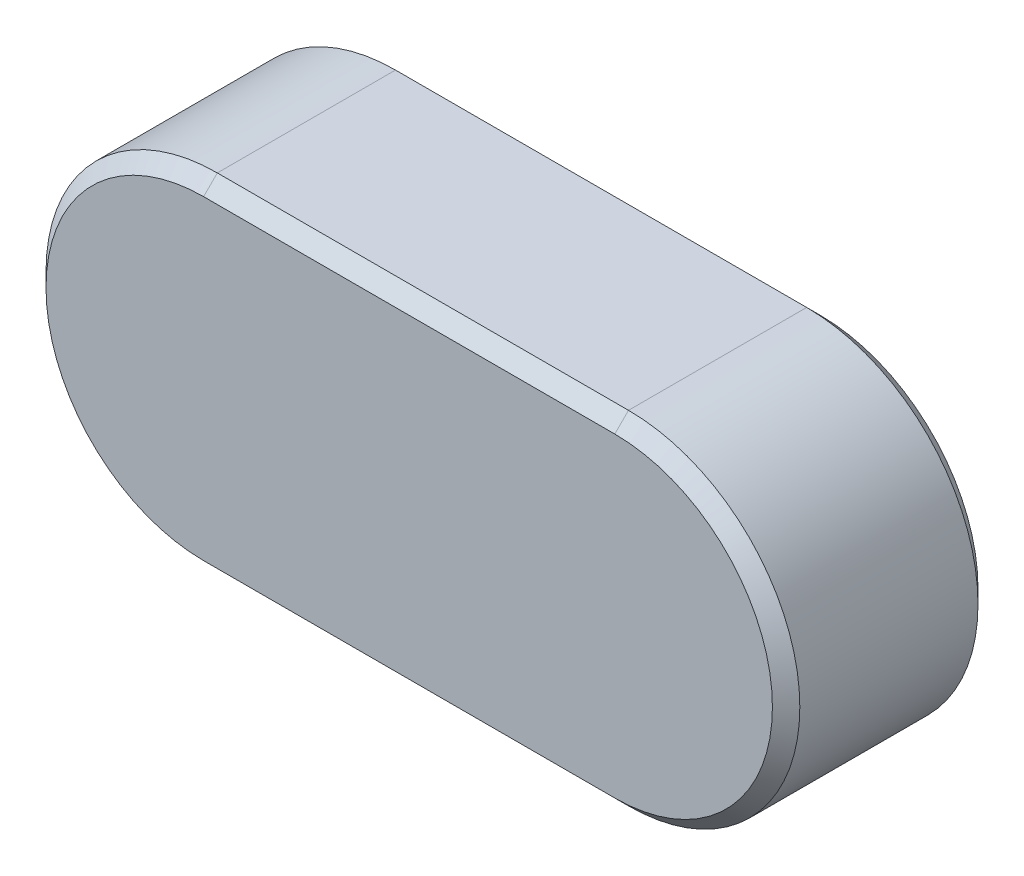
ISO-10303-21;
HEADER;
FILE_DESCRIPTION(('STEP AP214'),'2;1');
FILE_NAME('part.step','',(''),(''),'','','');
FILE_SCHEMA(('AUTOMOTIVE_DESIGN { 1 0 10303 214 1 1 1 1 }'));
ENDSEC;
DATA;
#1=APPLICATION_CONTEXT('core data for automotive mechanical design processes');
#2=APPLICATION_PROTOCOL_DEFINITION('international standard','automotive_design',2000,#1);
#3=PRODUCT_CONTEXT('',#1,'mechanical');
#4=PRODUCT('Part','Part','',(#3));
#5=PRODUCT_RELATED_PRODUCT_CATEGORY('part','',(#4));
#6=PRODUCT_DEFINITION_FORMATION('','',#4);
#7=PRODUCT_DEFINITION_CONTEXT('part definition',#1,'design');
#8=PRODUCT_DEFINITION('design','',#6,#7);
#9=PRODUCT_DEFINITION_SHAPE('','',#8);
#10=(LENGTH_UNIT() NAMED_UNIT(*) SI_UNIT(.MILLI.,.METRE.));
#11=(NAMED_UNIT(*) PLANE_ANGLE_UNIT() SI_UNIT($,.RADIAN.));
#12=(NAMED_UNIT(*) SI_UNIT($,.STERADIAN.) SOLID_ANGLE_UNIT());
#13=UNCERTAINTY_MEASURE_WITH_UNIT(LENGTH_MEASURE(1.E-05),#10,'distance_accuracy_value','');
#14=(GEOMETRIC_REPRESENTATION_CONTEXT(3) GLOBAL_UNCERTAINTY_ASSIGNED_CONTEXT((#13)) GLOBAL_UNIT_ASSIGNED_CONTEXT((#10,
#11,#12)) REPRESENTATION_CONTEXT('',''));
#15=CARTESIAN_POINT('',(0.,0.,0.));
#16=DIRECTION('',(0.,0.,1.));
#17=DIRECTION('',(1.,0.,0.));
#18=AXIS2_PLACEMENT_3D('',#15,#16,#17);
#19=CARTESIAN_POINT('',(0.,0.,6.));
#20=DIRECTION('',(0.,0.,-1.));
#21=DIRECTION('',(-1.,0.,0.));
#22=AXIS2_PLACEMENT_3D('',#19,#20,#21);
#23=CYLINDRICAL_SURFACE('',#22,5.);
#24=DIRECTION('',(0.,0.,-1.));
#25=VECTOR('',#24,1.);
#26=CARTESIAN_POINT('',(0.,-5.,6.));
#27=LINE('',#26,#25);
#28=CARTESIAN_POINT('',(0.,-5.,5.6));
#29=VERTEX_POINT('',#28);
#30=CARTESIAN_POINT('',(0.,-5.,0.400000000000001));
#31=VERTEX_POINT('',#30);
#32=EDGE_CURVE('E156',#29,#31,#27,.T.);
#33=ORIENTED_EDGE('',*,*,#32,.T.);
#34=CARTESIAN_POINT('',(0.,0.,0.400000000000001));
#35=DIRECTION('',(0.,0.,1.));
#36=DIRECTION('',(1.,0.,0.));
#37=AXIS2_PLACEMENT_3D('',#34,#35,#36);
#38=CIRCLE('',#37,5.);
#39=CARTESIAN_POINT('',(0.,5.,0.400000000000001));
#40=VERTEX_POINT('',#39);
#41=EDGE_CURVE('E180',#31,#40,#38,.T.);
#42=ORIENTED_EDGE('',*,*,#41,.T.);
#43=DIRECTION('',(0.,0.,-1.));
#44=VECTOR('',#43,1.);
#45=CARTESIAN_POINT('',(0.,5.,6.));
#46=LINE('',#45,#44);
#47=CARTESIAN_POINT('',(0.,5.,5.6));
#48=VERTEX_POINT('',#47);
#49=EDGE_CURVE('E125',#48,#40,#46,.T.);
#50=ORIENTED_EDGE('',*,*,#49,.F.);
#51=CARTESIAN_POINT('',(0.,0.,5.6));
#52=DIRECTION('',(0.,0.,1.));
#53=DIRECTION('',(1.,0.,0.));
#54=AXIS2_PLACEMENT_3D('',#51,#52,#53);
#55=CIRCLE('',#54,5.);
#56=EDGE_CURVE('E178',#48,#29,#55,.F.);
#57=ORIENTED_EDGE('',*,*,#56,.T.);
#58=EDGE_LOOP('',(#33,#42,#50,#57));
#59=FACE_BOUND('',#58,.T.);
#60=ADVANCED_FACE('F34',(#59),#23,.T.);
#61=CARTESIAN_POINT('',(0.,5.,6.));
#62=DIRECTION('',(0.,-1.,0.));
#63=DIRECTION('',(1.,0.,0.));
#64=AXIS2_PLACEMENT_3D('',#61,#62,#63);
#65=PLANE('',#64);
#66=ORIENTED_EDGE('',*,*,#49,.T.);
#67=DIRECTION('',(-1.,0.,0.));
#68=VECTOR('',#67,1.);
#69=CARTESIAN_POINT('',(0.,5.,0.399999999999998));
#70=LINE('',#69,#68);
#71=CARTESIAN_POINT('',(-12.,5.,0.400000000000001));
#72=VERTEX_POINT('',#71);
#73=EDGE_CURVE('E124',#40,#72,#70,.T.);
#74=ORIENTED_EDGE('',*,*,#73,.T.);
#75=DIRECTION('',(0.,0.,-1.));
#76=VECTOR('',#75,1.);
#77=CARTESIAN_POINT('',(-12.,5.,6.));
#78=LINE('',#77,#76);
#79=CARTESIAN_POINT('',(-12.,5.,5.6));
#80=VERTEX_POINT('',#79);
#81=EDGE_CURVE('E107',#80,#72,#78,.T.);
#82=ORIENTED_EDGE('',*,*,#81,.F.);
#83=DIRECTION('',(1.,0.,0.));
#84=VECTOR('',#83,1.);
#85=CARTESIAN_POINT('',(0.,5.,5.6));
#86=LINE('',#85,#84);
#87=EDGE_CURVE('E121',#80,#48,#86,.T.);
#88=ORIENTED_EDGE('',*,*,#87,.T.);
#89=EDGE_LOOP('',(#66,#74,#82,#88));
#90=FACE_BOUND('',#89,.T.);
#91=ADVANCED_FACE('F120',(#90),#65,.F.);
#92=CARTESIAN_POINT('',(-12.,0.,6.));
#93=DIRECTION('',(0.,0.,-1.));
#94=DIRECTION('',(-1.,0.,0.));
#95=AXIS2_PLACEMENT_3D('',#92,#93,#94);
#96=CYLINDRICAL_SURFACE('',#95,5.);
#97=ORIENTED_EDGE('',*,*,#81,.T.);
#98=CARTESIAN_POINT('',(-12.,0.,0.400000000000001));
#99=DIRECTION('',(0.,0.,1.));
#100=DIRECTION('',(1.,0.,0.));
#101=AXIS2_PLACEMENT_3D('',#98,#99,#100);
#102=CIRCLE('',#101,5.);
#103=CARTESIAN_POINT('',(-12.,-5.,0.400000000000001));
#104=VERTEX_POINT('',#103);
#105=EDGE_CURVE('E113',#72,#104,#102,.T.);
#106=ORIENTED_EDGE('',*,*,#105,.T.);
#107=DIRECTION('',(0.,0.,-1.));
#108=VECTOR('',#107,1.);
#109=CARTESIAN_POINT('',(-12.,-5.,6.));
#110=LINE('',#109,#108);
#111=CARTESIAN_POINT('',(-12.,-5.,5.6));
#112=VERTEX_POINT('',#111);
#113=EDGE_CURVE('E109',#112,#104,#110,.T.);
#114=ORIENTED_EDGE('',*,*,#113,.F.);
#115=CARTESIAN_POINT('',(-12.,0.,5.6));
#116=DIRECTION('',(0.,0.,1.));
#117=DIRECTION('',(1.,0.,0.));
#118=AXIS2_PLACEMENT_3D('',#115,#116,#117);
#119=CIRCLE('',#118,5.);
#120=EDGE_CURVE('E104',#112,#80,#119,.F.);
#121=ORIENTED_EDGE('',*,*,#120,.T.);
#122=EDGE_LOOP('',(#97,#106,#114,#121));
#123=FACE_BOUND('',#122,.T.);
#124=ADVANCED_FACE('F106',(#123),#96,.T.);
#125=CARTESIAN_POINT('',(-12.,-5.,6.));
#126=DIRECTION('',(0.,1.,0.));
#127=DIRECTION('',(-1.,0.,0.));
#128=AXIS2_PLACEMENT_3D('',#125,#126,#127);
#129=PLANE('',#128);
#130=ORIENTED_EDGE('',*,*,#113,.T.);
#131=DIRECTION('',(1.,0.,0.));
#132=VECTOR('',#131,1.);
#133=CARTESIAN_POINT('',(-12.,-5.,0.400000000000001));
#134=LINE('',#133,#132);
#135=EDGE_CURVE('E184',#104,#31,#134,.T.);
#136=ORIENTED_EDGE('',*,*,#135,.T.);
#137=ORIENTED_EDGE('',*,*,#32,.F.);
#138=DIRECTION('',(-1.,0.,0.));
#139=VECTOR('',#138,1.);
#140=CARTESIAN_POINT('',(-12.,-5.,5.6));
#141=LINE('',#140,#139);
#142=EDGE_CURVE('E182',#29,#112,#141,.T.);
#143=ORIENTED_EDGE('',*,*,#142,.T.);
#144=EDGE_LOOP('',(#130,#136,#137,#143));
#145=FACE_BOUND('',#144,.T.);
#146=ADVANCED_FACE('F194',(#145),#129,.F.);
#147=CARTESIAN_POINT('',(0.,0.,6.));
#148=DIRECTION('',(0.,0.,1.));
#149=DIRECTION('',(1.,0.,0.));
#150=AXIS2_PLACEMENT_3D('',#147,#148,#149);
#151=PLANE('',#150);
#152=CARTESIAN_POINT('',(0.,0.,6.));
#153=DIRECTION('',(0.,0.,1.));
#154=DIRECTION('',(1.,0.,0.));
#155=AXIS2_PLACEMENT_3D('',#152,#153,#154);
#156=CIRCLE('',#155,4.6);
#157=CARTESIAN_POINT('',(0.,-4.6,6.));
#158=VERTEX_POINT('',#157);
#159=CARTESIAN_POINT('',(0.,4.6,6.));
#160=VERTEX_POINT('',#159);
#161=EDGE_CURVE('E58',#158,#160,#156,.T.);
#162=ORIENTED_EDGE('',*,*,#161,.T.);
#163=DIRECTION('',(-1.,0.,0.));
#164=VECTOR('',#163,1.);
#165=CARTESIAN_POINT('',(-12.,4.6,6.));
#166=LINE('',#165,#164);
#167=CARTESIAN_POINT('',(-12.,4.6,6.));
#168=VERTEX_POINT('',#167);
#169=EDGE_CURVE('E11',#160,#168,#166,.T.);
#170=ORIENTED_EDGE('',*,*,#169,.T.);
#171=CARTESIAN_POINT('',(-12.,0.,6.));
#172=DIRECTION('',(0.,0.,1.));
#173=DIRECTION('',(1.,0.,0.));
#174=AXIS2_PLACEMENT_3D('',#171,#172,#173);
#175=CIRCLE('',#174,4.6);
#176=CARTESIAN_POINT('',(-12.,-4.6,6.));
#177=VERTEX_POINT('',#176);
#178=EDGE_CURVE('E43',#168,#177,#175,.T.);
#179=ORIENTED_EDGE('',*,*,#178,.T.);
#180=DIRECTION('',(1.,0.,0.));
#181=VECTOR('',#180,1.);
#182=CARTESIAN_POINT('',(0.,-4.6,6.));
#183=LINE('',#182,#181);
#184=EDGE_CURVE('E186',#177,#158,#183,.T.);
#185=ORIENTED_EDGE('',*,*,#184,.T.);
#186=EDGE_LOOP('',(#162,#170,#179,#185));
#187=FACE_BOUND('',#186,.T.);
#188=ADVANCED_FACE('F189',(#187),#151,.T.);
#189=CARTESIAN_POINT('',(0.,0.,0.));
#190=DIRECTION('',(0.,0.,1.));
#191=DIRECTION('',(1.,0.,0.));
#192=AXIS2_PLACEMENT_3D('',#189,#190,#191);
#193=PLANE('',#192);
#194=CARTESIAN_POINT('',(-12.,0.,0.));
#195=DIRECTION('',(0.,0.,1.));
#196=DIRECTION('',(1.,0.,0.));
#197=AXIS2_PLACEMENT_3D('',#194,#195,#196);
#198=CIRCLE('',#197,4.6);
#199=CARTESIAN_POINT('',(-12.,-4.6,0.));
#200=VERTEX_POINT('',#199);
#201=CARTESIAN_POINT('',(-12.,4.6,0.));
#202=VERTEX_POINT('',#201);
#203=EDGE_CURVE('E173',#200,#202,#198,.F.);
#204=ORIENTED_EDGE('',*,*,#203,.T.);
#205=DIRECTION('',(1.,0.,0.));
#206=VECTOR('',#205,1.);
#207=CARTESIAN_POINT('',(0.,4.6,0.));
#208=LINE('',#207,#206);
#209=CARTESIAN_POINT('',(0.,4.6,0.));
#210=VERTEX_POINT('',#209);
#211=EDGE_CURVE('E114',#202,#210,#208,.T.);
#212=ORIENTED_EDGE('',*,*,#211,.T.);
#213=CARTESIAN_POINT('',(0.,0.,0.));
#214=DIRECTION('',(0.,0.,1.));
#215=DIRECTION('',(1.,0.,0.));
#216=AXIS2_PLACEMENT_3D('',#213,#214,#215);
#217=CIRCLE('',#216,4.6);
#218=CARTESIAN_POINT('',(0.,-4.6,0.));
#219=VERTEX_POINT('',#218);
#220=EDGE_CURVE('E171',#210,#219,#217,.F.);
#221=ORIENTED_EDGE('',*,*,#220,.T.);
#222=DIRECTION('',(-1.,0.,0.));
#223=VECTOR('',#222,1.);
#224=CARTESIAN_POINT('',(0.,-4.6,0.));
#225=LINE('',#224,#223);
#226=EDGE_CURVE('E169',#219,#200,#225,.T.);
#227=ORIENTED_EDGE('',*,*,#226,.T.);
#228=EDGE_LOOP('',(#204,#212,#221,#227));
#229=FACE_BOUND('',#228,.T.);
#230=ADVANCED_FACE('F221',(#229),#193,.F.);
#231=CARTESIAN_POINT('',(-12.,-5.,0.400000000000001));
#232=DIRECTION('',(0.,0.707106781186547,0.707106781186547));
#233=DIRECTION('',(0.,-0.707106781186548,0.707106781186548));
#234=AXIS2_PLACEMENT_3D('',#231,#232,#233);
#235=PLANE('',#234);
#236=DIRECTION('',(0.,-0.707106781186547,0.707106781186547));
#237=VECTOR('',#236,1.);
#238=CARTESIAN_POINT('',(-12.,-4.6,0.));
#239=LINE('',#238,#237);
#240=EDGE_CURVE('E148',#200,#104,#239,.T.);
#241=ORIENTED_EDGE('',*,*,#240,.F.);
#242=ORIENTED_EDGE('',*,*,#226,.F.);
#243=DIRECTION('',(0.,0.707106781186547,-0.707106781186547));
#244=VECTOR('',#243,1.);
#245=CARTESIAN_POINT('',(0.,-5.,0.400000000000001));
#246=LINE('',#245,#244);
#247=EDGE_CURVE('E136',#31,#219,#246,.T.);
#248=ORIENTED_EDGE('',*,*,#247,.F.);
#249=ORIENTED_EDGE('',*,*,#135,.F.);
#250=EDGE_LOOP('',(#241,#242,#248,#249));
#251=FACE_BOUND('',#250,.T.);
#252=ADVANCED_FACE('F197',(#251),#235,.F.);
#253=CARTESIAN_POINT('',(0.,0.,0.400000000000001));
#254=DIRECTION('',(0.,0.,1.));
#255=DIRECTION('',(1.,0.,0.));
#256=AXIS2_PLACEMENT_3D('',#253,#254,#255);
#257=CONICAL_SURFACE('',#256,5.,0.785398163397448);
#258=ORIENTED_EDGE('',*,*,#247,.T.);
#259=ORIENTED_EDGE('',*,*,#220,.F.);
#260=DIRECTION('',(0.,-0.707106781186547,-0.707106781186547));
#261=VECTOR('',#260,1.);
#262=CARTESIAN_POINT('',(0.,5.,0.400000000000001));
#263=LINE('',#262,#261);
#264=EDGE_CURVE('E142',#40,#210,#263,.T.);
#265=ORIENTED_EDGE('',*,*,#264,.F.);
#266=ORIENTED_EDGE('',*,*,#41,.F.);
#267=EDGE_LOOP('',(#258,#259,#265,#266));
#268=FACE_BOUND('',#267,.T.);
#269=ADVANCED_FACE('F200',(#268),#257,.T.);
#270=CARTESIAN_POINT('',(-12.,0.,0.400000000000001));
#271=DIRECTION('',(0.,0.,1.));
#272=DIRECTION('',(1.,0.,0.));
#273=AXIS2_PLACEMENT_3D('',#270,#271,#272);
#274=CONICAL_SURFACE('',#273,5.,0.785398163397448);
#275=ORIENTED_EDGE('',*,*,#240,.T.);
#276=ORIENTED_EDGE('',*,*,#105,.F.);
#277=DIRECTION('',(0.,0.707106781186547,0.707106781186547));
#278=VECTOR('',#277,1.);
#279=CARTESIAN_POINT('',(-12.,4.6,0.));
#280=LINE('',#279,#278);
#281=EDGE_CURVE('E139',#202,#72,#280,.T.);
#282=ORIENTED_EDGE('',*,*,#281,.F.);
#283=ORIENTED_EDGE('',*,*,#203,.F.);
#284=EDGE_LOOP('',(#275,#276,#282,#283));
#285=FACE_BOUND('',#284,.T.);
#286=ADVANCED_FACE('F203',(#285),#274,.T.);
#287=CARTESIAN_POINT('',(0.,5.,0.399999999999998));
#288=DIRECTION('',(0.,-0.707106781186548,0.707106781186548));
#289=DIRECTION('',(0.,-0.707106781186548,-0.707106781186548));
#290=AXIS2_PLACEMENT_3D('',#287,#288,#289);
#291=PLANE('',#290);
#292=ORIENTED_EDGE('',*,*,#264,.T.);
#293=ORIENTED_EDGE('',*,*,#211,.F.);
#294=ORIENTED_EDGE('',*,*,#281,.T.);
#295=ORIENTED_EDGE('',*,*,#73,.F.);
#296=EDGE_LOOP('',(#292,#293,#294,#295));
#297=FACE_BOUND('',#296,.T.);
#298=ADVANCED_FACE('F201',(#297),#291,.F.);
#299=CARTESIAN_POINT('',(0.,-4.6,6.));
#300=DIRECTION('',(0.,-0.707106781186551,0.707106781186544));
#301=DIRECTION('',(0.,-0.707106781186544,-0.707106781186551));
#302=AXIS2_PLACEMENT_3D('',#299,#300,#301);
#303=PLANE('',#302);
#304=DIRECTION('',(0.,0.707106781186544,0.707106781186551));
#305=VECTOR('',#304,1.);
#306=CARTESIAN_POINT('',(-12.,-5.,5.6));
#307=LINE('',#306,#305);
#308=EDGE_CURVE('E133',#112,#177,#307,.T.);
#309=ORIENTED_EDGE('',*,*,#308,.F.);
#310=ORIENTED_EDGE('',*,*,#142,.F.);
#311=DIRECTION('',(0.,-0.707106781186544,-0.707106781186551));
#312=VECTOR('',#311,1.);
#313=CARTESIAN_POINT('',(0.,-4.6,6.));
#314=LINE('',#313,#312);
#315=EDGE_CURVE('E38',#158,#29,#314,.T.);
#316=ORIENTED_EDGE('',*,*,#315,.F.);
#317=ORIENTED_EDGE('',*,*,#184,.F.);
#318=EDGE_LOOP('',(#309,#310,#316,#317));
#319=FACE_BOUND('',#318,.T.);
#320=ADVANCED_FACE('F36',(#319),#303,.T.);
#321=CARTESIAN_POINT('',(0.,0.,6.));
#322=DIRECTION('',(0.,0.,-1.));
#323=DIRECTION('',(-1.,0.,0.));
#324=AXIS2_PLACEMENT_3D('',#321,#322,#323);
#325=CONICAL_SURFACE('',#324,4.6,0.785398163397444);
#326=ORIENTED_EDGE('',*,*,#315,.T.);
#327=ORIENTED_EDGE('',*,*,#56,.F.);
#328=DIRECTION('',(0.,0.707106781186544,-0.707106781186551));
#329=VECTOR('',#328,1.);
#330=CARTESIAN_POINT('',(0.,4.6,6.));
#331=LINE('',#330,#329);
#332=EDGE_CURVE('E128',#160,#48,#331,.T.);
#333=ORIENTED_EDGE('',*,*,#332,.F.);
#334=ORIENTED_EDGE('',*,*,#161,.F.);
#335=EDGE_LOOP('',(#326,#327,#333,#334));
#336=FACE_BOUND('',#335,.T.);
#337=ADVANCED_FACE('F192',(#336),#325,.T.);
#338=CARTESIAN_POINT('',(-12.,0.,6.));
#339=DIRECTION('',(0.,0.,-1.));
#340=DIRECTION('',(-1.,0.,0.));
#341=AXIS2_PLACEMENT_3D('',#338,#339,#340);
#342=CONICAL_SURFACE('',#341,4.6,0.785398163397444);
#343=ORIENTED_EDGE('',*,*,#308,.T.);
#344=ORIENTED_EDGE('',*,*,#178,.F.);
#345=DIRECTION('',(0.,-0.707106781186544,0.707106781186551));
#346=VECTOR('',#345,1.);
#347=CARTESIAN_POINT('',(-12.,5.,5.6));
#348=LINE('',#347,#346);
#349=EDGE_CURVE('E51',#80,#168,#348,.T.);
#350=ORIENTED_EDGE('',*,*,#349,.F.);
#351=ORIENTED_EDGE('',*,*,#120,.F.);
#352=EDGE_LOOP('',(#343,#344,#350,#351));
#353=FACE_BOUND('',#352,.T.);
#354=ADVANCED_FACE('F131',(#353),#342,.T.);
#355=CARTESIAN_POINT('',(0.,4.6,6.));
#356=DIRECTION('',(0.,0.707106781186551,0.707106781186544));
#357=DIRECTION('',(0.,-0.707106781186544,0.707106781186551));
#358=AXIS2_PLACEMENT_3D('',#355,#356,#357);
#359=PLANE('',#358);
#360=ORIENTED_EDGE('',*,*,#332,.T.);
#361=ORIENTED_EDGE('',*,*,#87,.F.);
#362=ORIENTED_EDGE('',*,*,#349,.T.);
#363=ORIENTED_EDGE('',*,*,#169,.F.);
#364=EDGE_LOOP('',(#360,#361,#362,#363));
#365=FACE_BOUND('',#364,.T.);
#366=ADVANCED_FACE('F127',(#365),#359,.T.);
#367=CLOSED_SHELL('',(#60,#91,#124,#146,#188,#230,#252,#269,#286,#298,#320,#337,#354,#366));
#368=MANIFOLD_SOLID_BREP('B2',#367);
#369=ADVANCED_BREP_SHAPE_REPRESENTATION('',(#18,#368),#14);
#370=SHAPE_DEFINITION_REPRESENTATION(#9,#369);
ENDSEC;
END-ISO-10303-21;
